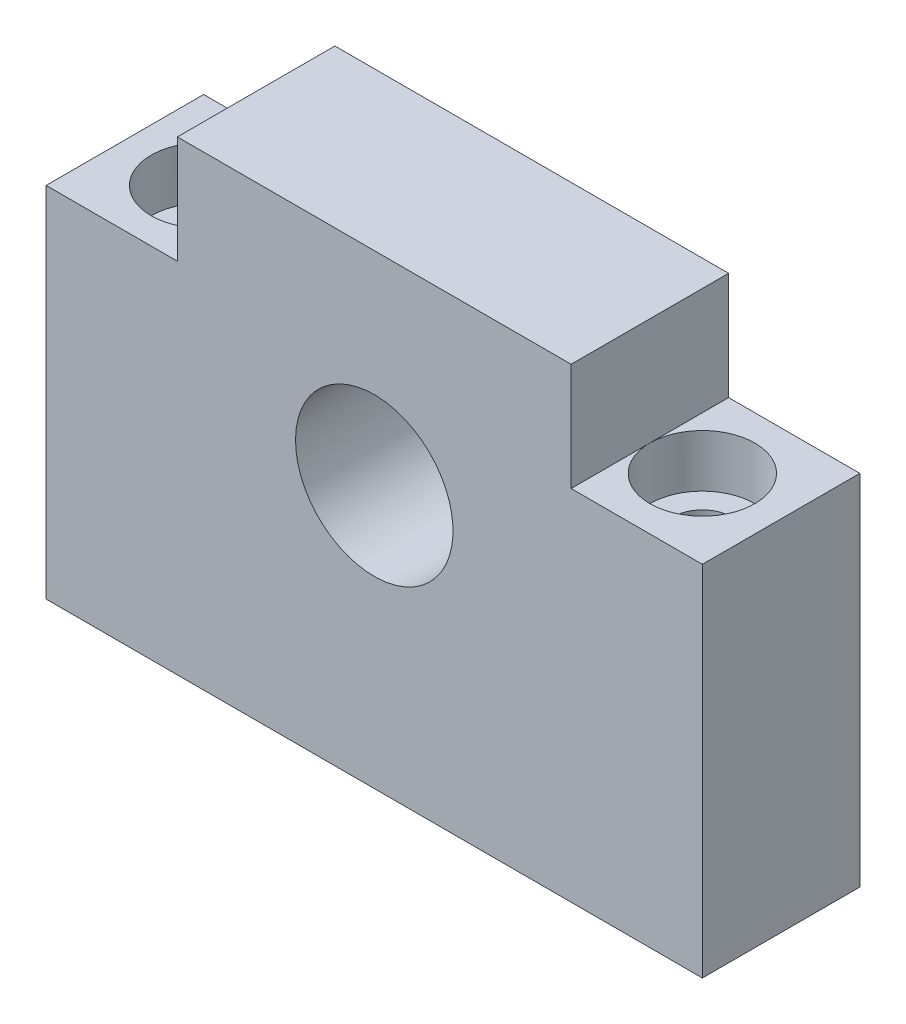
ISO-10303-21;
HEADER;
FILE_DESCRIPTION(('STEP AP214'),'2;1');
FILE_NAME('part.step','',(''),(''),'','','');
FILE_SCHEMA(('AUTOMOTIVE_DESIGN { 1 0 10303 214 1 1 1 1 }'));
ENDSEC;
DATA;
#1=APPLICATION_CONTEXT('core data for automotive mechanical design processes');
#2=APPLICATION_PROTOCOL_DEFINITION('international standard','automotive_design',2000,#1);
#3=PRODUCT_CONTEXT('',#1,'mechanical');
#4=PRODUCT('Part','Part','',(#3));
#5=PRODUCT_RELATED_PRODUCT_CATEGORY('part','',(#4));
#6=PRODUCT_DEFINITION_FORMATION('','',#4);
#7=PRODUCT_DEFINITION_CONTEXT('part definition',#1,'design');
#8=PRODUCT_DEFINITION('design','',#6,#7);
#9=PRODUCT_DEFINITION_SHAPE('','',#8);
#10=(LENGTH_UNIT() NAMED_UNIT(*) SI_UNIT(.MILLI.,.METRE.));
#11=(NAMED_UNIT(*) PLANE_ANGLE_UNIT() SI_UNIT($,.RADIAN.));
#12=(NAMED_UNIT(*) SI_UNIT($,.STERADIAN.) SOLID_ANGLE_UNIT());
#13=UNCERTAINTY_MEASURE_WITH_UNIT(LENGTH_MEASURE(1.E-05),#10,'distance_accuracy_value','');
#14=(GEOMETRIC_REPRESENTATION_CONTEXT(3) GLOBAL_UNCERTAINTY_ASSIGNED_CONTEXT((#13)) GLOBAL_UNIT_ASSIGNED_CONTEXT((#10,
#11,#12)) REPRESENTATION_CONTEXT('',''));
#15=CARTESIAN_POINT('',(0.,0.,0.));
#16=DIRECTION('',(0.,0.,1.));
#17=DIRECTION('',(1.,0.,0.));
#18=AXIS2_PLACEMENT_3D('',#15,#16,#17);
#19=CARTESIAN_POINT('',(0.,27.3,12.));
#20=DIRECTION('',(0.,-1.,0.));
#21=DIRECTION('',(0.,0.,-1.));
#22=AXIS2_PLACEMENT_3D('',#19,#20,#21);
#23=PLANE('',#22);
#24=DIRECTION('',(0.,0.,-1.));
#25=VECTOR('',#24,1.);
#26=CARTESIAN_POINT('',(9.99999999999999,27.3,12.));
#27=LINE('',#26,#25);
#28=CARTESIAN_POINT('',(9.99999999999999,27.3,12.));
#29=VERTEX_POINT('',#28);
#30=CARTESIAN_POINT('',(9.99999999999999,27.3,6.));
#31=VERTEX_POINT('',#30);
#32=EDGE_CURVE('E148',#29,#31,#27,.T.);
#33=ORIENTED_EDGE('',*,*,#32,.T.);
#34=CARTESIAN_POINT('',(5.99999999999999,27.3,6.));
#35=DIRECTION('',(0.,1.,0.));
#36=DIRECTION('',(0.,0.,1.));
#37=AXIS2_PLACEMENT_3D('',#34,#35,#36);
#38=CIRCLE('',#37,3.99999999999999);
#39=EDGE_CURVE('E57',#31,#31,#38,.T.);
#40=ORIENTED_EDGE('',*,*,#39,.F.);
#41=CARTESIAN_POINT('',(9.99999999999999,27.3,0.));
#42=VERTEX_POINT('',#41);
#43=EDGE_CURVE('E147',#31,#42,#27,.T.);
#44=ORIENTED_EDGE('',*,*,#43,.T.);
#45=DIRECTION('',(-1.,0.,0.));
#46=VECTOR('',#45,1.);
#47=CARTESIAN_POINT('',(0.,27.3,0.));
#48=LINE('',#47,#46);
#49=CARTESIAN_POINT('',(0.,27.3,0.));
#50=VERTEX_POINT('',#49);
#51=EDGE_CURVE('E171',#42,#50,#48,.T.);
#52=ORIENTED_EDGE('',*,*,#51,.T.);
#53=DIRECTION('',(0.,0.,-1.));
#54=VECTOR('',#53,1.);
#55=CARTESIAN_POINT('',(0.,27.3,12.));
#56=LINE('',#55,#54);
#57=CARTESIAN_POINT('',(0.,27.3,12.));
#58=VERTEX_POINT('',#57);
#59=EDGE_CURVE('E164',#58,#50,#56,.T.);
#60=ORIENTED_EDGE('',*,*,#59,.F.);
#61=DIRECTION('',(-1.,0.,0.));
#62=VECTOR('',#61,1.);
#63=CARTESIAN_POINT('',(0.,27.3,12.));
#64=LINE('',#63,#62);
#65=EDGE_CURVE('E160',#29,#58,#64,.T.);
#66=ORIENTED_EDGE('',*,*,#65,.F.);
#67=EDGE_LOOP('',(#33,#40,#44,#52,#60,#66));
#68=FACE_BOUND('',#67,.T.);
#69=ADVANCED_FACE('F39',(#68),#23,.F.);
#70=CARTESIAN_POINT('',(0.,0.,12.));
#71=DIRECTION('',(1.,0.,0.));
#72=DIRECTION('',(0.,1.,0.));
#73=AXIS2_PLACEMENT_3D('',#70,#71,#72);
#74=PLANE('',#73);
#75=DIRECTION('',(0.,-1.,0.));
#76=VECTOR('',#75,1.);
#77=CARTESIAN_POINT('',(0.,0.,0.));
#78=LINE('',#77,#76);
#79=CARTESIAN_POINT('',(0.,0.,0.));
#80=VERTEX_POINT('',#79);
#81=EDGE_CURVE('E151',#50,#80,#78,.T.);
#82=ORIENTED_EDGE('',*,*,#81,.T.);
#83=DIRECTION('',(0.,0.,-1.));
#84=VECTOR('',#83,1.);
#85=CARTESIAN_POINT('',(0.,0.,12.));
#86=LINE('',#85,#84);
#87=CARTESIAN_POINT('',(0.,0.,12.));
#88=VERTEX_POINT('',#87);
#89=EDGE_CURVE('E11',#88,#80,#86,.T.);
#90=ORIENTED_EDGE('',*,*,#89,.F.);
#91=DIRECTION('',(0.,-1.,0.));
#92=VECTOR('',#91,1.);
#93=CARTESIAN_POINT('',(0.,0.,12.));
#94=LINE('',#93,#92);
#95=EDGE_CURVE('E152',#58,#88,#94,.T.);
#96=ORIENTED_EDGE('',*,*,#95,.F.);
#97=ORIENTED_EDGE('',*,*,#59,.T.);
#98=EDGE_LOOP('',(#82,#90,#96,#97));
#99=FACE_BOUND('',#98,.T.);
#100=ADVANCED_FACE('F41',(#99),#74,.F.);
#101=CARTESIAN_POINT('',(0.,0.,12.));
#102=DIRECTION('',(0.,1.,0.));
#103=DIRECTION('',(0.,0.,1.));
#104=AXIS2_PLACEMENT_3D('',#101,#102,#103);
#105=PLANE('',#104);
#106=CARTESIAN_POINT('',(44.,0.,6.));
#107=DIRECTION('',(0.,1.,0.));
#108=DIRECTION('',(0.,0.,1.));
#109=AXIS2_PLACEMENT_3D('',#106,#107,#108);
#110=CIRCLE('',#109,2.24999999999999);
#111=CARTESIAN_POINT('',(44.,0.,8.24999999999999));
#112=VERTEX_POINT('',#111);
#113=EDGE_CURVE('E219',#112,#112,#110,.T.);
#114=ORIENTED_EDGE('',*,*,#113,.T.);
#115=EDGE_LOOP('',(#114));
#116=FACE_BOUND('',#115,.T.);
#117=CARTESIAN_POINT('',(5.99999999999999,0.,6.));
#118=DIRECTION('',(0.,1.,0.));
#119=DIRECTION('',(0.,0.,1.));
#120=AXIS2_PLACEMENT_3D('',#117,#118,#119);
#121=CIRCLE('',#120,2.24999999999999);
#122=CARTESIAN_POINT('',(5.99999999999999,0.,8.24999999999999));
#123=VERTEX_POINT('',#122);
#124=EDGE_CURVE('E207',#123,#123,#121,.T.);
#125=ORIENTED_EDGE('',*,*,#124,.T.);
#126=EDGE_LOOP('',(#125));
#127=FACE_BOUND('',#126,.T.);
#128=DIRECTION('',(1.,0.,0.));
#129=VECTOR('',#128,1.);
#130=CARTESIAN_POINT('',(0.,0.,0.));
#131=LINE('',#130,#129);
#132=CARTESIAN_POINT('',(50.,0.,0.));
#133=VERTEX_POINT('',#132);
#134=EDGE_CURVE('E167',#80,#133,#131,.T.);
#135=ORIENTED_EDGE('',*,*,#134,.T.);
#136=DIRECTION('',(0.,0.,-1.));
#137=VECTOR('',#136,1.);
#138=CARTESIAN_POINT('',(50.,0.,12.));
#139=LINE('',#138,#137);
#140=CARTESIAN_POINT('',(50.,0.,12.));
#141=VERTEX_POINT('',#140);
#142=EDGE_CURVE('E47',#141,#133,#139,.T.);
#143=ORIENTED_EDGE('',*,*,#142,.F.);
#144=DIRECTION('',(1.,0.,0.));
#145=VECTOR('',#144,1.);
#146=CARTESIAN_POINT('',(0.,0.,12.));
#147=LINE('',#146,#145);
#148=EDGE_CURVE('E155',#88,#141,#147,.T.);
#149=ORIENTED_EDGE('',*,*,#148,.F.);
#150=ORIENTED_EDGE('',*,*,#89,.T.);
#151=EDGE_LOOP('',(#135,#143,#149,#150));
#152=FACE_BOUND('',#151,.T.);
#153=ADVANCED_FACE('F193',(#116,#127,#152),#105,.F.);
#154=CARTESIAN_POINT('',(50.,0.,12.));
#155=DIRECTION('',(-1.,0.,0.));
#156=DIRECTION('',(0.,-1.,0.));
#157=AXIS2_PLACEMENT_3D('',#154,#155,#156);
#158=PLANE('',#157);
#159=DIRECTION('',(0.,1.,0.));
#160=VECTOR('',#159,1.);
#161=CARTESIAN_POINT('',(50.,0.,0.));
#162=LINE('',#161,#160);
#163=CARTESIAN_POINT('',(50.,27.3,0.));
#164=VERTEX_POINT('',#163);
#165=EDGE_CURVE('E169',#133,#164,#162,.T.);
#166=ORIENTED_EDGE('',*,*,#165,.T.);
#167=DIRECTION('',(0.,0.,-1.));
#168=VECTOR('',#167,1.);
#169=CARTESIAN_POINT('',(50.,27.3,12.));
#170=LINE('',#169,#168);
#171=CARTESIAN_POINT('',(50.,27.3,12.));
#172=VERTEX_POINT('',#171);
#173=EDGE_CURVE('E175',#172,#164,#170,.T.);
#174=ORIENTED_EDGE('',*,*,#173,.F.);
#175=DIRECTION('',(0.,1.,0.));
#176=VECTOR('',#175,1.);
#177=CARTESIAN_POINT('',(50.,0.,12.));
#178=LINE('',#177,#176);
#179=EDGE_CURVE('E158',#141,#172,#178,.T.);
#180=ORIENTED_EDGE('',*,*,#179,.F.);
#181=ORIENTED_EDGE('',*,*,#142,.T.);
#182=EDGE_LOOP('',(#166,#174,#180,#181));
#183=FACE_BOUND('',#182,.T.);
#184=ADVANCED_FACE('F182',(#183),#158,.F.);
#185=DIRECTION('',(0.,0.,1.));
#186=VECTOR('',#185,1.);
#187=CARTESIAN_POINT('',(40.,27.3,12.));
#188=LINE('',#187,#186);
#189=CARTESIAN_POINT('',(40.,27.3,0.));
#190=VERTEX_POINT('',#189);
#191=CARTESIAN_POINT('',(40.,27.3,6.));
#192=VERTEX_POINT('',#191);
#193=EDGE_CURVE('E116',#190,#192,#188,.T.);
#194=ORIENTED_EDGE('',*,*,#193,.T.);
#195=CARTESIAN_POINT('',(44.,27.3,6.));
#196=DIRECTION('',(0.,1.,0.));
#197=DIRECTION('',(0.,0.,1.));
#198=AXIS2_PLACEMENT_3D('',#195,#196,#197);
#199=CIRCLE('',#198,3.99999999999999);
#200=EDGE_CURVE('E52',#192,#192,#199,.T.);
#201=ORIENTED_EDGE('',*,*,#200,.F.);
#202=CARTESIAN_POINT('',(40.,27.3,12.));
#203=VERTEX_POINT('',#202);
#204=EDGE_CURVE('E144',#192,#203,#188,.T.);
#205=ORIENTED_EDGE('',*,*,#204,.T.);
#206=EDGE_CURVE('E161',#172,#203,#64,.T.);
#207=ORIENTED_EDGE('',*,*,#206,.F.);
#208=ORIENTED_EDGE('',*,*,#173,.T.);
#209=EDGE_CURVE('E156',#164,#190,#48,.T.);
#210=ORIENTED_EDGE('',*,*,#209,.T.);
#211=EDGE_LOOP('',(#194,#201,#205,#207,#208,#210));
#212=FACE_BOUND('',#211,.T.);
#213=ADVANCED_FACE('F187',(#212),#23,.F.);
#214=CARTESIAN_POINT('',(0.,0.,12.));
#215=DIRECTION('',(0.,0.,-1.));
#216=DIRECTION('',(-1.,0.,0.));
#217=AXIS2_PLACEMENT_3D('',#214,#215,#216);
#218=PLANE('',#217);
#219=CARTESIAN_POINT('',(25.,20.,12.));
#220=DIRECTION('',(0.,0.,-1.));
#221=DIRECTION('',(-1.,0.,0.));
#222=AXIS2_PLACEMENT_3D('',#219,#220,#221);
#223=CIRCLE('',#222,6.);
#224=CARTESIAN_POINT('',(19.,20.,12.));
#225=VERTEX_POINT('',#224);
#226=EDGE_CURVE('E141',#225,#225,#223,.T.);
#227=ORIENTED_EDGE('',*,*,#226,.T.);
#228=EDGE_LOOP('',(#227));
#229=FACE_BOUND('',#228,.T.);
#230=ORIENTED_EDGE('',*,*,#206,.T.);
#231=DIRECTION('',(0.,1.,0.));
#232=VECTOR('',#231,1.);
#233=CARTESIAN_POINT('',(40.,5.5,12.));
#234=LINE('',#233,#232);
#235=CARTESIAN_POINT('',(40.,35.5,12.));
#236=VERTEX_POINT('',#235);
#237=EDGE_CURVE('E140',#203,#236,#234,.T.);
#238=ORIENTED_EDGE('',*,*,#237,.T.);
#239=DIRECTION('',(-1.,0.,0.));
#240=VECTOR('',#239,1.);
#241=CARTESIAN_POINT('',(9.99999999999999,35.5,12.));
#242=LINE('',#241,#240);
#243=CARTESIAN_POINT('',(9.99999999999999,35.5,12.));
#244=VERTEX_POINT('',#243);
#245=EDGE_CURVE('E128',#236,#244,#242,.T.);
#246=ORIENTED_EDGE('',*,*,#245,.T.);
#247=DIRECTION('',(0.,-1.,0.));
#248=VECTOR('',#247,1.);
#249=CARTESIAN_POINT('',(9.99999999999999,5.5,12.));
#250=LINE('',#249,#248);
#251=EDGE_CURVE('E138',#244,#29,#250,.T.);
#252=ORIENTED_EDGE('',*,*,#251,.T.);
#253=ORIENTED_EDGE('',*,*,#65,.T.);
#254=ORIENTED_EDGE('',*,*,#95,.T.);
#255=ORIENTED_EDGE('',*,*,#148,.T.);
#256=ORIENTED_EDGE('',*,*,#179,.T.);
#257=EDGE_LOOP('',(#230,#238,#246,#252,#253,#254,#255,#256));
#258=FACE_BOUND('',#257,.T.);
#259=ADVANCED_FACE('F190',(#229,#258),#218,.F.);
#260=CARTESIAN_POINT('',(0.,0.,0.));
#261=DIRECTION('',(0.,0.,-1.));
#262=DIRECTION('',(-1.,0.,0.));
#263=AXIS2_PLACEMENT_3D('',#260,#261,#262);
#264=PLANE('',#263);
#265=CARTESIAN_POINT('',(25.,20.,0.));
#266=DIRECTION('',(0.,0.,-1.));
#267=DIRECTION('',(-1.,0.,0.));
#268=AXIS2_PLACEMENT_3D('',#265,#266,#267);
#269=CIRCLE('',#268,6.);
#270=CARTESIAN_POINT('',(19.,20.,0.));
#271=VERTEX_POINT('',#270);
#272=EDGE_CURVE('E204',#271,#271,#269,.T.);
#273=ORIENTED_EDGE('',*,*,#272,.F.);
#274=EDGE_LOOP('',(#273));
#275=FACE_BOUND('',#274,.T.);
#276=ORIENTED_EDGE('',*,*,#51,.F.);
#277=DIRECTION('',(0.,-1.,0.));
#278=VECTOR('',#277,1.);
#279=CARTESIAN_POINT('',(9.99999999999999,5.5,0.));
#280=LINE('',#279,#278);
#281=CARTESIAN_POINT('',(9.99999999999999,35.5,0.));
#282=VERTEX_POINT('',#281);
#283=EDGE_CURVE('E122',#282,#42,#280,.T.);
#284=ORIENTED_EDGE('',*,*,#283,.F.);
#285=DIRECTION('',(-1.,0.,0.));
#286=VECTOR('',#285,1.);
#287=CARTESIAN_POINT('',(9.99999999999999,35.5,0.));
#288=LINE('',#287,#286);
#289=CARTESIAN_POINT('',(40.,35.5,0.));
#290=VERTEX_POINT('',#289);
#291=EDGE_CURVE('E121',#290,#282,#288,.T.);
#292=ORIENTED_EDGE('',*,*,#291,.F.);
#293=DIRECTION('',(0.,1.,0.));
#294=VECTOR('',#293,1.);
#295=CARTESIAN_POINT('',(40.,5.5,0.));
#296=LINE('',#295,#294);
#297=EDGE_CURVE('E108',#190,#290,#296,.T.);
#298=ORIENTED_EDGE('',*,*,#297,.F.);
#299=ORIENTED_EDGE('',*,*,#209,.F.);
#300=ORIENTED_EDGE('',*,*,#165,.F.);
#301=ORIENTED_EDGE('',*,*,#134,.F.);
#302=ORIENTED_EDGE('',*,*,#81,.F.);
#303=EDGE_LOOP('',(#276,#284,#292,#298,#299,#300,#301,#302));
#304=FACE_BOUND('',#303,.T.);
#305=ADVANCED_FACE('F133',(#275,#304),#264,.T.);
#306=CARTESIAN_POINT('',(9.99999999999999,5.5,0.));
#307=DIRECTION('',(-1.,0.,0.));
#308=DIRECTION('',(0.,0.,1.));
#309=AXIS2_PLACEMENT_3D('',#306,#307,#308);
#310=PLANE('',#309);
#311=ORIENTED_EDGE('',*,*,#32,.F.);
#312=ORIENTED_EDGE('',*,*,#251,.F.);
#313=DIRECTION('',(0.,0.,1.));
#314=VECTOR('',#313,1.);
#315=CARTESIAN_POINT('',(9.99999999999999,35.5,0.));
#316=LINE('',#315,#314);
#317=EDGE_CURVE('E129',#282,#244,#316,.T.);
#318=ORIENTED_EDGE('',*,*,#317,.F.);
#319=ORIENTED_EDGE('',*,*,#283,.T.);
#320=ORIENTED_EDGE('',*,*,#43,.F.);
#321=EDGE_LOOP('',(#311,#312,#318,#319,#320));
#322=FACE_BOUND('',#321,.T.);
#323=ADVANCED_FACE('F201',(#322),#310,.T.);
#324=CARTESIAN_POINT('',(40.,5.5,0.));
#325=DIRECTION('',(1.,0.,0.));
#326=DIRECTION('',(0.,0.,-1.));
#327=AXIS2_PLACEMENT_3D('',#324,#325,#326);
#328=PLANE('',#327);
#329=ORIENTED_EDGE('',*,*,#193,.F.);
#330=ORIENTED_EDGE('',*,*,#297,.T.);
#331=DIRECTION('',(0.,0.,1.));
#332=VECTOR('',#331,1.);
#333=CARTESIAN_POINT('',(40.,35.5,0.));
#334=LINE('',#333,#332);
#335=EDGE_CURVE('E112',#290,#236,#334,.T.);
#336=ORIENTED_EDGE('',*,*,#335,.T.);
#337=ORIENTED_EDGE('',*,*,#237,.F.);
#338=ORIENTED_EDGE('',*,*,#204,.F.);
#339=EDGE_LOOP('',(#329,#330,#336,#337,#338));
#340=FACE_BOUND('',#339,.T.);
#341=ADVANCED_FACE('F110',(#340),#328,.T.);
#342=CARTESIAN_POINT('',(9.99999999999999,35.5,0.));
#343=DIRECTION('',(0.,1.,0.));
#344=DIRECTION('',(0.,0.,1.));
#345=AXIS2_PLACEMENT_3D('',#342,#343,#344);
#346=PLANE('',#345);
#347=ORIENTED_EDGE('',*,*,#245,.F.);
#348=ORIENTED_EDGE('',*,*,#335,.F.);
#349=ORIENTED_EDGE('',*,*,#291,.T.);
#350=ORIENTED_EDGE('',*,*,#317,.T.);
#351=EDGE_LOOP('',(#347,#348,#349,#350));
#352=FACE_BOUND('',#351,.T.);
#353=ADVANCED_FACE('F126',(#352),#346,.T.);
#354=CARTESIAN_POINT('',(25.,20.,12.));
#355=DIRECTION('',(0.,0.,-1.));
#356=DIRECTION('',(-1.,0.,0.));
#357=AXIS2_PLACEMENT_3D('',#354,#355,#356);
#358=CYLINDRICAL_SURFACE('',#357,6.);
#359=ORIENTED_EDGE('',*,*,#226,.F.);
#360=EDGE_LOOP('',(#359));
#361=FACE_BOUND('',#360,.T.);
#362=ORIENTED_EDGE('',*,*,#272,.T.);
#363=EDGE_LOOP('',(#362));
#364=FACE_BOUND('',#363,.T.);
#365=ADVANCED_FACE('F269',(#361,#364),#358,.F.);
#366=CARTESIAN_POINT('',(5.99999999999999,27.3,6.));
#367=DIRECTION('',(0.,1.,0.));
#368=DIRECTION('',(0.,0.,1.));
#369=AXIS2_PLACEMENT_3D('',#366,#367,#368);
#370=CYLINDRICAL_SURFACE('',#369,2.25);
#371=ORIENTED_EDGE('',*,*,#124,.F.);
#372=EDGE_LOOP('',(#371));
#373=FACE_BOUND('',#372,.T.);
#374=CARTESIAN_POINT('',(5.99999999999999,23.3,6.));
#375=DIRECTION('',(0.,1.,0.));
#376=DIRECTION('',(0.,0.,1.));
#377=AXIS2_PLACEMENT_3D('',#374,#375,#376);
#378=CIRCLE('',#377,2.25000000000001);
#379=CARTESIAN_POINT('',(5.99999999999999,23.3,8.25000000000001));
#380=VERTEX_POINT('',#379);
#381=EDGE_CURVE('E212',#380,#380,#378,.T.);
#382=ORIENTED_EDGE('',*,*,#381,.T.);
#383=EDGE_LOOP('',(#382));
#384=FACE_BOUND('',#383,.T.);
#385=ADVANCED_FACE('F265',(#373,#384),#370,.F.);
#386=CARTESIAN_POINT('',(8.25000000000001,23.3,6.));
#387=DIRECTION('',(0.,-1.,0.));
#388=DIRECTION('',(0.,0.,-1.));
#389=AXIS2_PLACEMENT_3D('',#386,#387,#388);
#390=PLANE('',#389);
#391=ORIENTED_EDGE('',*,*,#381,.F.);
#392=EDGE_LOOP('',(#391));
#393=FACE_BOUND('',#392,.T.);
#394=CARTESIAN_POINT('',(5.99999999999999,23.3,6.));
#395=DIRECTION('',(0.,1.,0.));
#396=DIRECTION('',(0.,0.,1.));
#397=AXIS2_PLACEMENT_3D('',#394,#395,#396);
#398=CIRCLE('',#397,3.99999999999999);
#399=CARTESIAN_POINT('',(5.99999999999999,23.3,9.99999999999999));
#400=VERTEX_POINT('',#399);
#401=EDGE_CURVE('E215',#400,#400,#398,.T.);
#402=ORIENTED_EDGE('',*,*,#401,.T.);
#403=EDGE_LOOP('',(#402));
#404=FACE_BOUND('',#403,.T.);
#405=ADVANCED_FACE('F268',(#393,#404),#390,.F.);
#406=CARTESIAN_POINT('',(5.99999999999999,27.3,6.));
#407=DIRECTION('',(0.,1.,0.));
#408=DIRECTION('',(0.,0.,1.));
#409=AXIS2_PLACEMENT_3D('',#406,#407,#408);
#410=CYLINDRICAL_SURFACE('',#409,3.99999999999999);
#411=ORIENTED_EDGE('',*,*,#401,.F.);
#412=EDGE_LOOP('',(#411));
#413=FACE_BOUND('',#412,.T.);
#414=ORIENTED_EDGE('',*,*,#39,.T.);
#415=EDGE_LOOP('',(#414));
#416=FACE_BOUND('',#415,.T.);
#417=ADVANCED_FACE('F275',(#413,#416),#410,.F.);
#418=CARTESIAN_POINT('',(44.,27.3,6.));
#419=DIRECTION('',(0.,1.,0.));
#420=DIRECTION('',(0.,0.,1.));
#421=AXIS2_PLACEMENT_3D('',#418,#419,#420);
#422=CYLINDRICAL_SURFACE('',#421,2.25);
#423=ORIENTED_EDGE('',*,*,#113,.F.);
#424=EDGE_LOOP('',(#423));
#425=FACE_BOUND('',#424,.T.);
#426=CARTESIAN_POINT('',(44.,23.3,6.));
#427=DIRECTION('',(0.,1.,0.));
#428=DIRECTION('',(0.,0.,1.));
#429=AXIS2_PLACEMENT_3D('',#426,#427,#428);
#430=CIRCLE('',#429,2.25000000000002);
#431=CARTESIAN_POINT('',(44.,23.3,8.25000000000002));
#432=VERTEX_POINT('',#431);
#433=EDGE_CURVE('E222',#432,#432,#430,.T.);
#434=ORIENTED_EDGE('',*,*,#433,.T.);
#435=EDGE_LOOP('',(#434));
#436=FACE_BOUND('',#435,.T.);
#437=ADVANCED_FACE('F238',(#425,#436),#422,.F.);
#438=CARTESIAN_POINT('',(46.25,23.3,6.));
#439=DIRECTION('',(0.,-1.,0.));
#440=DIRECTION('',(0.,0.,-1.));
#441=AXIS2_PLACEMENT_3D('',#438,#439,#440);
#442=PLANE('',#441);
#443=ORIENTED_EDGE('',*,*,#433,.F.);
#444=EDGE_LOOP('',(#443));
#445=FACE_BOUND('',#444,.T.);
#446=CARTESIAN_POINT('',(44.,23.3,6.));
#447=DIRECTION('',(0.,1.,0.));
#448=DIRECTION('',(0.,0.,1.));
#449=AXIS2_PLACEMENT_3D('',#446,#447,#448);
#450=CIRCLE('',#449,3.99999999999999);
#451=CARTESIAN_POINT('',(44.,23.3,9.99999999999999));
#452=VERTEX_POINT('',#451);
#453=EDGE_CURVE('E225',#452,#452,#450,.T.);
#454=ORIENTED_EDGE('',*,*,#453,.T.);
#455=EDGE_LOOP('',(#454));
#456=FACE_BOUND('',#455,.T.);
#457=ADVANCED_FACE('F230',(#445,#456),#442,.F.);
#458=CARTESIAN_POINT('',(44.,27.3,6.));
#459=DIRECTION('',(0.,1.,0.));
#460=DIRECTION('',(0.,0.,1.));
#461=AXIS2_PLACEMENT_3D('',#458,#459,#460);
#462=CYLINDRICAL_SURFACE('',#461,3.99999999999999);
#463=ORIENTED_EDGE('',*,*,#453,.F.);
#464=EDGE_LOOP('',(#463));
#465=FACE_BOUND('',#464,.T.);
#466=ORIENTED_EDGE('',*,*,#200,.T.);
#467=EDGE_LOOP('',(#466));
#468=FACE_BOUND('',#467,.T.);
#469=ADVANCED_FACE('F232',(#465,#468),#462,.F.);
#470=CLOSED_SHELL('',(#69,#100,#153,#184,#213,#259,#305,#323,#341,#353,#365,#385,#405,#417,#437,
#457,#469));
#471=MANIFOLD_SOLID_BREP('B2',#470);
#472=ADVANCED_BREP_SHAPE_REPRESENTATION('',(#18,#471),#14);
#473=SHAPE_DEFINITION_REPRESENTATION(#9,#472);
ENDSEC;
END-ISO-10303-21;
